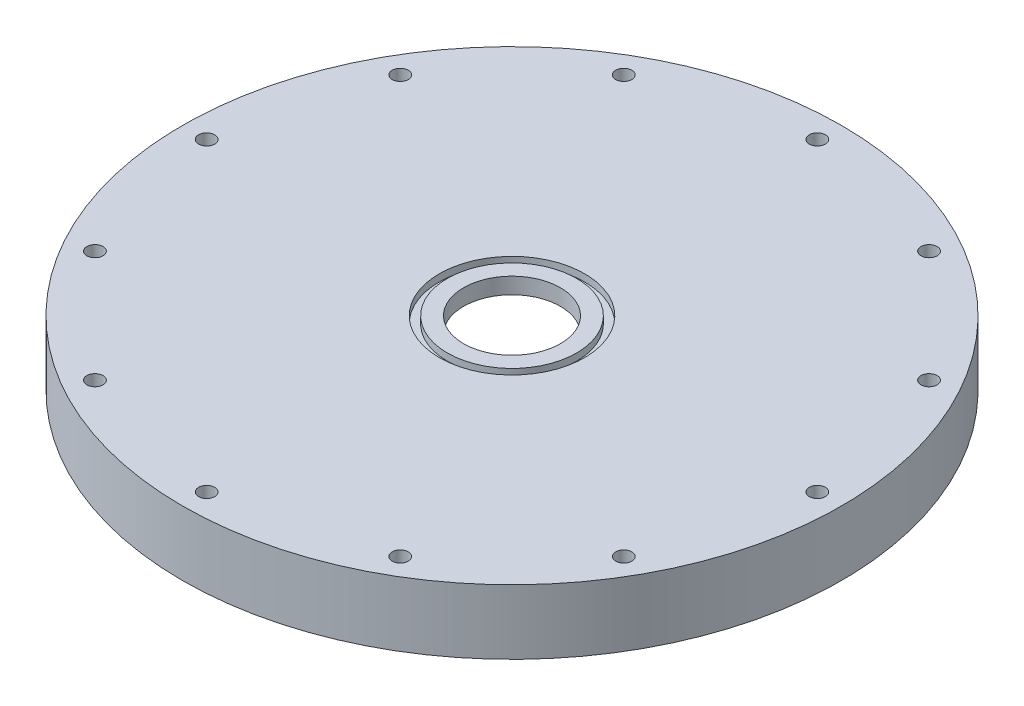
ISO-10303-21;
HEADER;
FILE_DESCRIPTION(('STEP AP214'),'2;1');
FILE_NAME('part.step','',(''),(''),'','','');
FILE_SCHEMA(('AUTOMOTIVE_DESIGN { 1 0 10303 214 1 1 1 1 }'));
ENDSEC;
DATA;
#1=APPLICATION_CONTEXT('core data for automotive mechanical design processes');
#2=APPLICATION_PROTOCOL_DEFINITION('international standard','automotive_design',2000,#1);
#3=PRODUCT_CONTEXT('',#1,'mechanical');
#4=PRODUCT('Part','Part','',(#3));
#5=PRODUCT_RELATED_PRODUCT_CATEGORY('part','',(#4));
#6=PRODUCT_DEFINITION_FORMATION('','',#4);
#7=PRODUCT_DEFINITION_CONTEXT('part definition',#1,'design');
#8=PRODUCT_DEFINITION('design','',#6,#7);
#9=PRODUCT_DEFINITION_SHAPE('','',#8);
#10=(LENGTH_UNIT() NAMED_UNIT(*) SI_UNIT(.MILLI.,.METRE.));
#11=(NAMED_UNIT(*) PLANE_ANGLE_UNIT() SI_UNIT($,.RADIAN.));
#12=(NAMED_UNIT(*) SI_UNIT($,.STERADIAN.) SOLID_ANGLE_UNIT());
#13=UNCERTAINTY_MEASURE_WITH_UNIT(LENGTH_MEASURE(1.E-05),#10,'distance_accuracy_value','');
#14=(GEOMETRIC_REPRESENTATION_CONTEXT(3) GLOBAL_UNCERTAINTY_ASSIGNED_CONTEXT((#13)) GLOBAL_UNIT_ASSIGNED_CONTEXT((#10,
#11,#12)) REPRESENTATION_CONTEXT('',''));
#15=CARTESIAN_POINT('',(0.,0.,0.));
#16=DIRECTION('',(0.,0.,1.));
#17=DIRECTION('',(1.,0.,0.));
#18=AXIS2_PLACEMENT_3D('',#15,#16,#17);
#19=CARTESIAN_POINT('',(0.,6.34999999999999,0.));
#20=DIRECTION('',(0.,-1.,0.));
#21=DIRECTION('',(0.,0.,-1.));
#22=AXIS2_PLACEMENT_3D('',#19,#20,#21);
#23=PLANE('',#22);
#24=CARTESIAN_POINT('',(0.,6.34999999999999,0.));
#25=DIRECTION('',(0.,1.,0.));
#26=DIRECTION('',(0.,0.,1.));
#27=AXIS2_PLACEMENT_3D('',#24,#25,#26);
#28=CIRCLE('',#27,19.05);
#29=CARTESIAN_POINT('',(0.,6.34999999999999,19.05));
#30=VERTEX_POINT('',#29);
#31=EDGE_CURVE('E62',#30,#30,#28,.T.);
#32=ORIENTED_EDGE('',*,*,#31,.F.);
#33=EDGE_LOOP('',(#32));
#34=FACE_BOUND('',#33,.T.);
#35=CARTESIAN_POINT('',(0.,6.34999999999999,0.));
#36=DIRECTION('',(0.,1.,0.));
#37=DIRECTION('',(0.,0.,1.));
#38=AXIS2_PLACEMENT_3D('',#35,#36,#37);
#39=CIRCLE('',#38,25.4);
#40=CARTESIAN_POINT('',(0.,6.34999999999999,25.4));
#41=VERTEX_POINT('',#40);
#42=EDGE_CURVE('E72',#41,#41,#39,.T.);
#43=ORIENTED_EDGE('',*,*,#42,.T.);
#44=EDGE_LOOP('',(#43));
#45=FACE_BOUND('',#44,.T.);
#46=ADVANCED_FACE('F36',(#34,#45),#23,.F.);
#47=CARTESIAN_POINT('',(-69.8499999999999,0.,0.));
#48=DIRECTION('',(0.,1.,0.));
#49=DIRECTION('',(0.,0.,1.));
#50=AXIS2_PLACEMENT_3D('',#47,#48,#49);
#51=PLANE('',#50);
#52=CARTESIAN_POINT('',(0.,0.,0.));
#53=DIRECTION('',(0.,1.,0.));
#54=DIRECTION('',(0.,0.,1.));
#55=AXIS2_PLACEMENT_3D('',#52,#53,#54);
#56=CIRCLE('',#55,19.05);
#57=CARTESIAN_POINT('',(0.,0.,19.05));
#58=VERTEX_POINT('',#57);
#59=EDGE_CURVE('E59',#58,#58,#56,.T.);
#60=ORIENTED_EDGE('',*,*,#59,.T.);
#61=EDGE_LOOP('',(#60));
#62=FACE_BOUND('',#61,.T.);
#63=CARTESIAN_POINT('',(0.,0.,0.));
#64=DIRECTION('',(0.,-1.,0.));
#65=DIRECTION('',(0.,0.,-1.));
#66=AXIS2_PLACEMENT_3D('',#63,#64,#65);
#67=CIRCLE('',#66,69.8499999999999);
#68=CARTESIAN_POINT('',(0.,0.,-69.8499999999999));
#69=VERTEX_POINT('',#68);
#70=EDGE_CURVE('E10',#69,#69,#67,.T.);
#71=ORIENTED_EDGE('',*,*,#70,.T.);
#72=EDGE_LOOP('',(#71));
#73=FACE_BOUND('',#72,.T.);
#74=ADVANCED_FACE('F38',(#62,#73),#51,.F.);
#75=CARTESIAN_POINT('',(0.,-16.51,0.));
#76=DIRECTION('',(0.,-1.,0.));
#77=DIRECTION('',(0.,0.,-1.));
#78=AXIS2_PLACEMENT_3D('',#75,#76,#77);
#79=TOROIDAL_SURFACE('',#78,69.85,16.51);
#80=ORIENTED_EDGE('',*,*,#70,.F.);
#81=EDGE_LOOP('',(#80));
#82=FACE_BOUND('',#81,.T.);
#83=CARTESIAN_POINT('',(0.,-16.5100000000001,0.));
#84=DIRECTION('',(0.,-1.,0.));
#85=DIRECTION('',(0.,0.,-1.));
#86=AXIS2_PLACEMENT_3D('',#83,#84,#85);
#87=CIRCLE('',#86,86.36);
#88=CARTESIAN_POINT('',(0.,-16.5100000000001,-86.36));
#89=VERTEX_POINT('',#88);
#90=EDGE_CURVE('E43',#89,#89,#87,.T.);
#91=ORIENTED_EDGE('',*,*,#90,.T.);
#92=EDGE_LOOP('',(#91));
#93=FACE_BOUND('',#92,.T.);
#94=ADVANCED_FACE('F200',(#82,#93),#79,.F.);
#95=CARTESIAN_POINT('',(0.,0.,0.));
#96=DIRECTION('',(0.,-1.,0.));
#97=DIRECTION('',(0.,0.,-1.));
#98=AXIS2_PLACEMENT_3D('',#95,#96,#97);
#99=CYLINDRICAL_SURFACE('',#98,86.36);
#100=ORIENTED_EDGE('',*,*,#90,.F.);
#101=EDGE_LOOP('',(#100));
#102=FACE_BOUND('',#101,.T.);
#103=CARTESIAN_POINT('',(0.,-19.05,0.));
#104=DIRECTION('',(0.,-1.,0.));
#105=DIRECTION('',(0.,0.,-1.));
#106=AXIS2_PLACEMENT_3D('',#103,#104,#105);
#107=CIRCLE('',#106,86.36);
#108=CARTESIAN_POINT('',(0.,-19.05,-86.36));
#109=VERTEX_POINT('',#108);
#110=EDGE_CURVE('E47',#109,#109,#107,.T.);
#111=ORIENTED_EDGE('',*,*,#110,.T.);
#112=EDGE_LOOP('',(#111));
#113=FACE_BOUND('',#112,.T.);
#114=ADVANCED_FACE('F191',(#102,#113),#99,.F.);
#115=CARTESIAN_POINT('',(-129.54,-19.05,0.));
#116=DIRECTION('',(0.,1.,0.));
#117=DIRECTION('',(0.,0.,1.));
#118=AXIS2_PLACEMENT_3D('',#115,#116,#117);
#119=PLANE('',#118);
#120=CARTESIAN_POINT('',(0.,-19.05,-120.015));
#121=DIRECTION('',(0.,1.,0.));
#122=DIRECTION('',(0.,0.,1.));
#123=AXIS2_PLACEMENT_3D('',#120,#121,#122);
#124=CIRCLE('',#123,3.175);
#125=CARTESIAN_POINT('',(0.,-19.05,-116.84));
#126=VERTEX_POINT('',#125);
#127=EDGE_CURVE('E143',#126,#126,#124,.T.);
#128=ORIENTED_EDGE('',*,*,#127,.T.);
#129=EDGE_LOOP('',(#128));
#130=FACE_BOUND('',#129,.T.);
#131=CARTESIAN_POINT('',(-60.0074999999977,-19.05,-103.936038835181));
#132=DIRECTION('',(0.,1.,0.));
#133=DIRECTION('',(0.,0.,1.));
#134=AXIS2_PLACEMENT_3D('',#131,#132,#133);
#135=CIRCLE('',#134,3.175);
#136=CARTESIAN_POINT('',(-60.0074999999977,-19.05,-100.761038835181));
#137=VERTEX_POINT('',#136);
#138=EDGE_CURVE('E137',#137,#137,#135,.T.);
#139=ORIENTED_EDGE('',*,*,#138,.T.);
#140=EDGE_LOOP('',(#139));
#141=FACE_BOUND('',#140,.T.);
#142=CARTESIAN_POINT('',(-103.936038835181,-19.05,-60.0074999999852));
#143=DIRECTION('',(0.,1.,0.));
#144=DIRECTION('',(0.,0.,1.));
#145=AXIS2_PLACEMENT_3D('',#142,#143,#144);
#146=CIRCLE('',#145,3.175);
#147=CARTESIAN_POINT('',(-103.936038835181,-19.05,-56.8324999999852));
#148=VERTEX_POINT('',#147);
#149=EDGE_CURVE('E131',#148,#148,#146,.T.);
#150=ORIENTED_EDGE('',*,*,#149,.T.);
#151=EDGE_LOOP('',(#150));
#152=FACE_BOUND('',#151,.T.);
#153=CARTESIAN_POINT('',(-120.014999999983,-19.05,1.70478084871697E-11));
#154=DIRECTION('',(0.,1.,0.));
#155=DIRECTION('',(0.,0.,1.));
#156=AXIS2_PLACEMENT_3D('',#153,#154,#155);
#157=CIRCLE('',#156,3.175);
#158=CARTESIAN_POINT('',(-120.014999999983,-19.05,3.17500000001705));
#159=VERTEX_POINT('',#158);
#160=EDGE_CURVE('E125',#159,#159,#157,.T.);
#161=ORIENTED_EDGE('',*,*,#160,.T.);
#162=EDGE_LOOP('',(#161));
#163=FACE_BOUND('',#162,.T.);
#164=CARTESIAN_POINT('',(-103.936038835164,-19.05,60.0075000000148));
#165=DIRECTION('',(0.,1.,0.));
#166=DIRECTION('',(0.,0.,1.));
#167=AXIS2_PLACEMENT_3D('',#164,#165,#166);
#168=CIRCLE('',#167,3.175);
#169=CARTESIAN_POINT('',(-103.936038835164,-19.05,63.1825000000148));
#170=VERTEX_POINT('',#169);
#171=EDGE_CURVE('E119',#170,#170,#168,.T.);
#172=ORIENTED_EDGE('',*,*,#171,.T.);
#173=EDGE_LOOP('',(#172));
#174=FACE_BOUND('',#173,.T.);
#175=CARTESIAN_POINT('',(-60.0074999999682,-19.05,103.936038835198));
#176=DIRECTION('',(0.,1.,0.));
#177=DIRECTION('',(0.,0.,1.));
#178=AXIS2_PLACEMENT_3D('',#175,#176,#177);
#179=CIRCLE('',#178,3.175);
#180=CARTESIAN_POINT('',(-60.0074999999682,-19.05,107.111038835198));
#181=VERTEX_POINT('',#180);
#182=EDGE_CURVE('E113',#181,#181,#179,.T.);
#183=ORIENTED_EDGE('',*,*,#182,.T.);
#184=EDGE_LOOP('',(#183));
#185=FACE_BOUND('',#184,.T.);
#186=CARTESIAN_POINT('',(3.40662217772195E-11,-19.05,120.015));
#187=DIRECTION('',(0.,1.,0.));
#188=DIRECTION('',(0.,0.,1.));
#189=AXIS2_PLACEMENT_3D('',#186,#187,#188);
#190=CIRCLE('',#189,3.175);
#191=CARTESIAN_POINT('',(3.40662217772195E-11,-19.05,123.19));
#192=VERTEX_POINT('',#191);
#193=EDGE_CURVE('E107',#192,#192,#190,.T.);
#194=ORIENTED_EDGE('',*,*,#193,.T.);
#195=EDGE_LOOP('',(#194));
#196=FACE_BOUND('',#195,.T.);
#197=CARTESIAN_POINT('',(60.0075000000318,-19.05,103.936038835181));
#198=DIRECTION('',(0.,1.,0.));
#199=DIRECTION('',(0.,0.,1.));
#200=AXIS2_PLACEMENT_3D('',#197,#198,#199);
#201=CIRCLE('',#200,3.17499999999999);
#202=CARTESIAN_POINT('',(60.0075000000318,-19.05,107.111038835181));
#203=VERTEX_POINT('',#202);
#204=EDGE_CURVE('E101',#203,#203,#201,.T.);
#205=ORIENTED_EDGE('',*,*,#204,.T.);
#206=EDGE_LOOP('',(#205));
#207=FACE_BOUND('',#206,.T.);
#208=CARTESIAN_POINT('',(103.936038835215,-19.05,60.0074999999852));
#209=DIRECTION('',(0.,1.,0.));
#210=DIRECTION('',(0.,0.,1.));
#211=AXIS2_PLACEMENT_3D('',#208,#209,#210);
#212=CIRCLE('',#211,3.175);
#213=CARTESIAN_POINT('',(103.936038835215,-19.05,63.1824999999852));
#214=VERTEX_POINT('',#213);
#215=EDGE_CURVE('E95',#214,#214,#212,.T.);
#216=ORIENTED_EDGE('',*,*,#215,.T.);
#217=EDGE_LOOP('',(#216));
#218=FACE_BOUND('',#217,.T.);
#219=CARTESIAN_POINT('',(120.015000000017,-19.05,-1.70331108886097E-11));
#220=DIRECTION('',(0.,1.,0.));
#221=DIRECTION('',(0.,0.,1.));
#222=AXIS2_PLACEMENT_3D('',#219,#220,#221);
#223=CIRCLE('',#222,3.175);
#224=CARTESIAN_POINT('',(120.015000000017,-19.05,3.17499999998296));
#225=VERTEX_POINT('',#224);
#226=EDGE_CURVE('E89',#225,#225,#223,.T.);
#227=ORIENTED_EDGE('',*,*,#226,.T.);
#228=EDGE_LOOP('',(#227));
#229=FACE_BOUND('',#228,.T.);
#230=CARTESIAN_POINT('',(103.936038835198,-19.05,-60.0075000000148));
#231=DIRECTION('',(0.,1.,0.));
#232=DIRECTION('',(0.,0.,1.));
#233=AXIS2_PLACEMENT_3D('',#230,#231,#232);
#234=CIRCLE('',#233,3.175);
#235=CARTESIAN_POINT('',(103.936038835198,-19.05,-56.8325000000148));
#236=VERTEX_POINT('',#235);
#237=EDGE_CURVE('E83',#236,#236,#234,.T.);
#238=ORIENTED_EDGE('',*,*,#237,.T.);
#239=EDGE_LOOP('',(#238));
#240=FACE_BOUND('',#239,.T.);
#241=CARTESIAN_POINT('',(60.0075000000023,-19.05,-103.936038835198));
#242=DIRECTION('',(0.,1.,0.));
#243=DIRECTION('',(0.,0.,1.));
#244=AXIS2_PLACEMENT_3D('',#241,#242,#243);
#245=CIRCLE('',#244,3.175);
#246=CARTESIAN_POINT('',(60.0075000000023,-19.05,-100.761038835198));
#247=VERTEX_POINT('',#246);
#248=EDGE_CURVE('E75',#247,#247,#245,.T.);
#249=ORIENTED_EDGE('',*,*,#248,.T.);
#250=EDGE_LOOP('',(#249));
#251=FACE_BOUND('',#250,.T.);
#252=ORIENTED_EDGE('',*,*,#110,.F.);
#253=EDGE_LOOP('',(#252));
#254=FACE_BOUND('',#253,.T.);
#255=CARTESIAN_POINT('',(0.,-19.05,0.));
#256=DIRECTION('',(0.,-1.,0.));
#257=DIRECTION('',(0.,0.,-1.));
#258=AXIS2_PLACEMENT_3D('',#255,#256,#257);
#259=CIRCLE('',#258,129.54);
#260=CARTESIAN_POINT('',(0.,-19.05,-129.54));
#261=VERTEX_POINT('',#260);
#262=EDGE_CURVE('E51',#261,#261,#259,.T.);
#263=ORIENTED_EDGE('',*,*,#262,.T.);
#264=EDGE_LOOP('',(#263));
#265=FACE_BOUND('',#264,.T.);
#266=ADVANCED_FACE('F185',(#130,#141,#152,#163,#174,#185,#196,#207,#218,#229,#240,#251,#254,
#265),#119,.F.);
#267=CARTESIAN_POINT('',(0.,0.,0.));
#268=DIRECTION('',(0.,-1.,0.));
#269=DIRECTION('',(0.,0.,-1.));
#270=AXIS2_PLACEMENT_3D('',#267,#268,#269);
#271=CYLINDRICAL_SURFACE('',#270,129.54);
#272=ORIENTED_EDGE('',*,*,#262,.F.);
#273=EDGE_LOOP('',(#272));
#274=FACE_BOUND('',#273,.T.);
#275=CARTESIAN_POINT('',(0.,6.34999999999998,0.));
#276=DIRECTION('',(0.,-1.,0.));
#277=DIRECTION('',(0.,0.,-1.));
#278=AXIS2_PLACEMENT_3D('',#275,#276,#277);
#279=CIRCLE('',#278,129.54);
#280=CARTESIAN_POINT('',(0.,6.34999999999998,-129.54));
#281=VERTEX_POINT('',#280);
#282=EDGE_CURVE('E56',#281,#281,#279,.T.);
#283=ORIENTED_EDGE('',*,*,#282,.T.);
#284=EDGE_LOOP('',(#283));
#285=FACE_BOUND('',#284,.T.);
#286=ADVANCED_FACE('F156',(#274,#285),#271,.T.);
#287=CARTESIAN_POINT('',(0.,6.34999999999999,-120.015));
#288=DIRECTION('',(0.,1.,0.));
#289=DIRECTION('',(0.,0.,1.));
#290=AXIS2_PLACEMENT_3D('',#287,#288,#289);
#291=CIRCLE('',#290,3.17499999999999);
#292=CARTESIAN_POINT('',(0.,6.34999999999999,-116.84));
#293=VERTEX_POINT('',#292);
#294=EDGE_CURVE('E146',#293,#293,#291,.T.);
#295=ORIENTED_EDGE('',*,*,#294,.F.);
#296=EDGE_LOOP('',(#295));
#297=FACE_BOUND('',#296,.T.);
#298=CARTESIAN_POINT('',(-60.0074999999977,6.34999999999999,-103.936038835181));
#299=DIRECTION('',(0.,1.,0.));
#300=DIRECTION('',(0.,0.,1.));
#301=AXIS2_PLACEMENT_3D('',#298,#299,#300);
#302=CIRCLE('',#301,3.17499999999998);
#303=CARTESIAN_POINT('',(-60.0074999999977,6.34999999999999,-100.761038835181));
#304=VERTEX_POINT('',#303);
#305=EDGE_CURVE('E140',#304,#304,#302,.T.);
#306=ORIENTED_EDGE('',*,*,#305,.F.);
#307=EDGE_LOOP('',(#306));
#308=FACE_BOUND('',#307,.T.);
#309=CARTESIAN_POINT('',(-103.936038835181,6.34999999999999,-60.0074999999852));
#310=DIRECTION('',(0.,1.,0.));
#311=DIRECTION('',(0.,0.,1.));
#312=AXIS2_PLACEMENT_3D('',#309,#310,#311);
#313=CIRCLE('',#312,3.17499999999998);
#314=CARTESIAN_POINT('',(-103.936038835181,6.34999999999999,-56.8324999999852));
#315=VERTEX_POINT('',#314);
#316=EDGE_CURVE('E134',#315,#315,#313,.T.);
#317=ORIENTED_EDGE('',*,*,#316,.F.);
#318=EDGE_LOOP('',(#317));
#319=FACE_BOUND('',#318,.T.);
#320=CARTESIAN_POINT('',(-120.014999999983,6.34999999999999,1.70478084871697E-11));
#321=DIRECTION('',(0.,1.,0.));
#322=DIRECTION('',(0.,0.,1.));
#323=AXIS2_PLACEMENT_3D('',#320,#321,#322);
#324=CIRCLE('',#323,3.17499999999998);
#325=CARTESIAN_POINT('',(-120.014999999983,6.34999999999999,3.17500000001703));
#326=VERTEX_POINT('',#325);
#327=EDGE_CURVE('E128',#326,#326,#324,.T.);
#328=ORIENTED_EDGE('',*,*,#327,.F.);
#329=EDGE_LOOP('',(#328));
#330=FACE_BOUND('',#329,.T.);
#331=CARTESIAN_POINT('',(-103.936038835164,6.34999999999999,60.0075000000148));
#332=DIRECTION('',(0.,1.,0.));
#333=DIRECTION('',(0.,0.,1.));
#334=AXIS2_PLACEMENT_3D('',#331,#332,#333);
#335=CIRCLE('',#334,3.17499999999998);
#336=CARTESIAN_POINT('',(-103.936038835164,6.34999999999999,63.1825000000148));
#337=VERTEX_POINT('',#336);
#338=EDGE_CURVE('E122',#337,#337,#335,.T.);
#339=ORIENTED_EDGE('',*,*,#338,.F.);
#340=EDGE_LOOP('',(#339));
#341=FACE_BOUND('',#340,.T.);
#342=CARTESIAN_POINT('',(-60.0074999999682,6.34999999999999,103.936038835198));
#343=DIRECTION('',(0.,1.,0.));
#344=DIRECTION('',(0.,0.,1.));
#345=AXIS2_PLACEMENT_3D('',#342,#343,#344);
#346=CIRCLE('',#345,3.17499999999998);
#347=CARTESIAN_POINT('',(-60.0074999999682,6.34999999999999,107.111038835198));
#348=VERTEX_POINT('',#347);
#349=EDGE_CURVE('E116',#348,#348,#346,.T.);
#350=ORIENTED_EDGE('',*,*,#349,.F.);
#351=EDGE_LOOP('',(#350));
#352=FACE_BOUND('',#351,.T.);
#353=CARTESIAN_POINT('',(3.40662217772195E-11,6.34999999999999,120.015));
#354=DIRECTION('',(0.,1.,0.));
#355=DIRECTION('',(0.,0.,1.));
#356=AXIS2_PLACEMENT_3D('',#353,#354,#355);
#357=CIRCLE('',#356,3.17499999999999);
#358=CARTESIAN_POINT('',(3.40662217772195E-11,6.34999999999999,123.19));
#359=VERTEX_POINT('',#358);
#360=EDGE_CURVE('E110',#359,#359,#357,.T.);
#361=ORIENTED_EDGE('',*,*,#360,.F.);
#362=EDGE_LOOP('',(#361));
#363=FACE_BOUND('',#362,.T.);
#364=CARTESIAN_POINT('',(60.0075000000318,6.34999999999999,103.936038835181));
#365=DIRECTION('',(0.,1.,0.));
#366=DIRECTION('',(0.,0.,1.));
#367=AXIS2_PLACEMENT_3D('',#364,#365,#366);
#368=CIRCLE('',#367,3.17499999999999);
#369=CARTESIAN_POINT('',(60.0075000000318,6.34999999999999,107.111038835181));
#370=VERTEX_POINT('',#369);
#371=EDGE_CURVE('E104',#370,#370,#368,.T.);
#372=ORIENTED_EDGE('',*,*,#371,.F.);
#373=EDGE_LOOP('',(#372));
#374=FACE_BOUND('',#373,.T.);
#375=CARTESIAN_POINT('',(103.936038835215,6.34999999999999,60.0074999999852));
#376=DIRECTION('',(0.,1.,0.));
#377=DIRECTION('',(0.,0.,1.));
#378=AXIS2_PLACEMENT_3D('',#375,#376,#377);
#379=CIRCLE('',#378,3.17499999999998);
#380=CARTESIAN_POINT('',(103.936038835215,6.34999999999999,63.1824999999852));
#381=VERTEX_POINT('',#380);
#382=EDGE_CURVE('E98',#381,#381,#379,.T.);
#383=ORIENTED_EDGE('',*,*,#382,.F.);
#384=EDGE_LOOP('',(#383));
#385=FACE_BOUND('',#384,.T.);
#386=CARTESIAN_POINT('',(120.015000000017,6.34999999999999,-1.70331108886097E-11));
#387=DIRECTION('',(0.,1.,0.));
#388=DIRECTION('',(0.,0.,1.));
#389=AXIS2_PLACEMENT_3D('',#386,#387,#388);
#390=CIRCLE('',#389,3.17499999999998);
#391=CARTESIAN_POINT('',(120.015000000017,6.34999999999999,3.17499999998295));
#392=VERTEX_POINT('',#391);
#393=EDGE_CURVE('E92',#392,#392,#390,.T.);
#394=ORIENTED_EDGE('',*,*,#393,.F.);
#395=EDGE_LOOP('',(#394));
#396=FACE_BOUND('',#395,.T.);
#397=CARTESIAN_POINT('',(103.936038835198,6.34999999999999,-60.0075000000148));
#398=DIRECTION('',(0.,1.,0.));
#399=DIRECTION('',(0.,0.,1.));
#400=AXIS2_PLACEMENT_3D('',#397,#398,#399);
#401=CIRCLE('',#400,3.17499999999998);
#402=CARTESIAN_POINT('',(103.936038835198,6.34999999999999,-56.8325000000148));
#403=VERTEX_POINT('',#402);
#404=EDGE_CURVE('E86',#403,#403,#401,.T.);
#405=ORIENTED_EDGE('',*,*,#404,.F.);
#406=EDGE_LOOP('',(#405));
#407=FACE_BOUND('',#406,.T.);
#408=CARTESIAN_POINT('',(60.0075000000023,6.34999999999999,-103.936038835198));
#409=DIRECTION('',(0.,1.,0.));
#410=DIRECTION('',(0.,0.,1.));
#411=AXIS2_PLACEMENT_3D('',#408,#409,#410);
#412=CIRCLE('',#411,3.17499999999998);
#413=CARTESIAN_POINT('',(60.0075000000023,6.34999999999999,-100.761038835198));
#414=VERTEX_POINT('',#413);
#415=EDGE_CURVE('E80',#414,#414,#412,.T.);
#416=ORIENTED_EDGE('',*,*,#415,.F.);
#417=EDGE_LOOP('',(#416));
#418=FACE_BOUND('',#417,.T.);
#419=CARTESIAN_POINT('',(0.,6.34999999999999,0.));
#420=DIRECTION('',(0.,1.,0.));
#421=DIRECTION('',(0.,0.,1.));
#422=AXIS2_PLACEMENT_3D('',#419,#420,#421);
#423=CIRCLE('',#422,28.575);
#424=CARTESIAN_POINT('',(0.,6.34999999999999,28.575));
#425=VERTEX_POINT('',#424);
#426=EDGE_CURVE('E66',#425,#425,#423,.T.);
#427=ORIENTED_EDGE('',*,*,#426,.F.);
#428=EDGE_LOOP('',(#427));
#429=FACE_BOUND('',#428,.T.);
#430=ORIENTED_EDGE('',*,*,#282,.F.);
#431=EDGE_LOOP('',(#430));
#432=FACE_BOUND('',#431,.T.);
#433=ADVANCED_FACE('F152',(#297,#308,#319,#330,#341,#352,#363,#374,#385,#396,#407,#418,#429,
#432),#23,.F.);
#434=CARTESIAN_POINT('',(0.,-19.05,0.));
#435=DIRECTION('',(0.,1.,0.));
#436=DIRECTION('',(0.,0.,1.));
#437=AXIS2_PLACEMENT_3D('',#434,#435,#436);
#438=CYLINDRICAL_SURFACE('',#437,19.05);
#439=ORIENTED_EDGE('',*,*,#31,.T.);
#440=EDGE_LOOP('',(#439));
#441=FACE_BOUND('',#440,.T.);
#442=ORIENTED_EDGE('',*,*,#59,.F.);
#443=EDGE_LOOP('',(#442));
#444=FACE_BOUND('',#443,.T.);
#445=ADVANCED_FACE('F155',(#441,#444),#438,.F.);
#446=CARTESIAN_POINT('',(0.,3.55599999999999,0.));
#447=DIRECTION('',(0.,1.,0.));
#448=DIRECTION('',(0.,0.,1.));
#449=AXIS2_PLACEMENT_3D('',#446,#447,#448);
#450=CYLINDRICAL_SURFACE('',#449,28.575);
#451=CARTESIAN_POINT('',(0.,3.55599999999999,0.));
#452=DIRECTION('',(0.,1.,0.));
#453=DIRECTION('',(0.,0.,1.));
#454=AXIS2_PLACEMENT_3D('',#451,#452,#453);
#455=CIRCLE('',#454,28.575);
#456=CARTESIAN_POINT('',(0.,3.55599999999999,28.575));
#457=VERTEX_POINT('',#456);
#458=EDGE_CURVE('E65',#457,#457,#455,.T.);
#459=ORIENTED_EDGE('',*,*,#458,.F.);
#460=EDGE_LOOP('',(#459));
#461=FACE_BOUND('',#460,.T.);
#462=ORIENTED_EDGE('',*,*,#426,.T.);
#463=EDGE_LOOP('',(#462));
#464=FACE_BOUND('',#463,.T.);
#465=ADVANCED_FACE('F207',(#461,#464),#450,.F.);
#466=CARTESIAN_POINT('',(0.,3.55599999999999,0.));
#467=DIRECTION('',(0.,1.,0.));
#468=DIRECTION('',(0.,0.,1.));
#469=AXIS2_PLACEMENT_3D('',#466,#467,#468);
#470=PLANE('',#469);
#471=CARTESIAN_POINT('',(0.,3.55599999999999,0.));
#472=DIRECTION('',(0.,1.,0.));
#473=DIRECTION('',(0.,0.,1.));
#474=AXIS2_PLACEMENT_3D('',#471,#472,#473);
#475=CIRCLE('',#474,25.4);
#476=CARTESIAN_POINT('',(0.,3.55599999999999,25.4));
#477=VERTEX_POINT('',#476);
#478=EDGE_CURVE('E69',#477,#477,#475,.T.);
#479=ORIENTED_EDGE('',*,*,#478,.F.);
#480=EDGE_LOOP('',(#479));
#481=FACE_BOUND('',#480,.T.);
#482=ORIENTED_EDGE('',*,*,#458,.T.);
#483=EDGE_LOOP('',(#482));
#484=FACE_BOUND('',#483,.T.);
#485=ADVANCED_FACE('F211',(#481,#484),#470,.T.);
#486=CARTESIAN_POINT('',(0.,3.55599999999999,0.));
#487=DIRECTION('',(0.,1.,0.));
#488=DIRECTION('',(0.,0.,1.));
#489=AXIS2_PLACEMENT_3D('',#486,#487,#488);
#490=CYLINDRICAL_SURFACE('',#489,25.4);
#491=ORIENTED_EDGE('',*,*,#478,.T.);
#492=EDGE_LOOP('',(#491));
#493=FACE_BOUND('',#492,.T.);
#494=ORIENTED_EDGE('',*,*,#42,.F.);
#495=EDGE_LOOP('',(#494));
#496=FACE_BOUND('',#495,.T.);
#497=ADVANCED_FACE('F215',(#493,#496),#490,.T.);
#498=CARTESIAN_POINT('',(60.0075000000023,6.34999999999999,-103.936038835198));
#499=DIRECTION('',(0.,1.,0.));
#500=DIRECTION('',(0.,0.,1.));
#501=AXIS2_PLACEMENT_3D('',#498,#499,#500);
#502=CYLINDRICAL_SURFACE('',#501,3.17499999999999);
#503=ORIENTED_EDGE('',*,*,#248,.F.);
#504=EDGE_LOOP('',(#503));
#505=FACE_BOUND('',#504,.T.);
#506=ORIENTED_EDGE('',*,*,#415,.T.);
#507=EDGE_LOOP('',(#506));
#508=FACE_BOUND('',#507,.T.);
#509=ADVANCED_FACE('F219',(#505,#508),#502,.F.);
#510=CARTESIAN_POINT('',(103.936038835198,6.34999999999999,-60.0075000000148));
#511=DIRECTION('',(0.,1.,0.));
#512=DIRECTION('',(0.,0.,1.));
#513=AXIS2_PLACEMENT_3D('',#510,#511,#512);
#514=CYLINDRICAL_SURFACE('',#513,3.17499999999999);
#515=ORIENTED_EDGE('',*,*,#237,.F.);
#516=EDGE_LOOP('',(#515));
#517=FACE_BOUND('',#516,.T.);
#518=ORIENTED_EDGE('',*,*,#404,.T.);
#519=EDGE_LOOP('',(#518));
#520=FACE_BOUND('',#519,.T.);
#521=ADVANCED_FACE('F223',(#517,#520),#514,.F.);
#522=CARTESIAN_POINT('',(120.015000000017,6.34999999999999,-1.70331108886097E-11));
#523=DIRECTION('',(0.,1.,0.));
#524=DIRECTION('',(0.,0.,1.));
#525=AXIS2_PLACEMENT_3D('',#522,#523,#524);
#526=CYLINDRICAL_SURFACE('',#525,3.17499999999999);
#527=ORIENTED_EDGE('',*,*,#226,.F.);
#528=EDGE_LOOP('',(#527));
#529=FACE_BOUND('',#528,.T.);
#530=ORIENTED_EDGE('',*,*,#393,.T.);
#531=EDGE_LOOP('',(#530));
#532=FACE_BOUND('',#531,.T.);
#533=ADVANCED_FACE('F227',(#529,#532),#526,.F.);
#534=CARTESIAN_POINT('',(103.936038835215,6.34999999999999,60.0074999999852));
#535=DIRECTION('',(0.,1.,0.));
#536=DIRECTION('',(0.,0.,1.));
#537=AXIS2_PLACEMENT_3D('',#534,#535,#536);
#538=CYLINDRICAL_SURFACE('',#537,3.17499999999999);
#539=ORIENTED_EDGE('',*,*,#215,.F.);
#540=EDGE_LOOP('',(#539));
#541=FACE_BOUND('',#540,.T.);
#542=ORIENTED_EDGE('',*,*,#382,.T.);
#543=EDGE_LOOP('',(#542));
#544=FACE_BOUND('',#543,.T.);
#545=ADVANCED_FACE('F231',(#541,#544),#538,.F.);
#546=CARTESIAN_POINT('',(60.0075000000318,6.34999999999999,103.936038835181));
#547=DIRECTION('',(0.,1.,0.));
#548=DIRECTION('',(0.,0.,1.));
#549=AXIS2_PLACEMENT_3D('',#546,#547,#548);
#550=CYLINDRICAL_SURFACE('',#549,3.17499999999999);
#551=ORIENTED_EDGE('',*,*,#204,.F.);
#552=EDGE_LOOP('',(#551));
#553=FACE_BOUND('',#552,.T.);
#554=ORIENTED_EDGE('',*,*,#371,.T.);
#555=EDGE_LOOP('',(#554));
#556=FACE_BOUND('',#555,.T.);
#557=ADVANCED_FACE('F235',(#553,#556),#550,.F.);
#558=CARTESIAN_POINT('',(3.40662217772195E-11,6.34999999999999,120.015));
#559=DIRECTION('',(0.,1.,0.));
#560=DIRECTION('',(0.,0.,1.));
#561=AXIS2_PLACEMENT_3D('',#558,#559,#560);
#562=CYLINDRICAL_SURFACE('',#561,3.17499999999999);
#563=ORIENTED_EDGE('',*,*,#193,.F.);
#564=EDGE_LOOP('',(#563));
#565=FACE_BOUND('',#564,.T.);
#566=ORIENTED_EDGE('',*,*,#360,.T.);
#567=EDGE_LOOP('',(#566));
#568=FACE_BOUND('',#567,.T.);
#569=ADVANCED_FACE('F239',(#565,#568),#562,.F.);
#570=CARTESIAN_POINT('',(-60.0074999999682,6.34999999999999,103.936038835198));
#571=DIRECTION('',(0.,1.,0.));
#572=DIRECTION('',(0.,0.,1.));
#573=AXIS2_PLACEMENT_3D('',#570,#571,#572);
#574=CYLINDRICAL_SURFACE('',#573,3.17499999999999);
#575=ORIENTED_EDGE('',*,*,#182,.F.);
#576=EDGE_LOOP('',(#575));
#577=FACE_BOUND('',#576,.T.);
#578=ORIENTED_EDGE('',*,*,#349,.T.);
#579=EDGE_LOOP('',(#578));
#580=FACE_BOUND('',#579,.T.);
#581=ADVANCED_FACE('F243',(#577,#580),#574,.F.);
#582=CARTESIAN_POINT('',(-103.936038835164,6.34999999999999,60.0075000000148));
#583=DIRECTION('',(0.,1.,0.));
#584=DIRECTION('',(0.,0.,1.));
#585=AXIS2_PLACEMENT_3D('',#582,#583,#584);
#586=CYLINDRICAL_SURFACE('',#585,3.17499999999999);
#587=ORIENTED_EDGE('',*,*,#171,.F.);
#588=EDGE_LOOP('',(#587));
#589=FACE_BOUND('',#588,.T.);
#590=ORIENTED_EDGE('',*,*,#338,.T.);
#591=EDGE_LOOP('',(#590));
#592=FACE_BOUND('',#591,.T.);
#593=ADVANCED_FACE('F247',(#589,#592),#586,.F.);
#594=CARTESIAN_POINT('',(-120.014999999983,6.34999999999999,1.70478084871697E-11));
#595=DIRECTION('',(0.,1.,0.));
#596=DIRECTION('',(0.,0.,1.));
#597=AXIS2_PLACEMENT_3D('',#594,#595,#596);
#598=CYLINDRICAL_SURFACE('',#597,3.17499999999999);
#599=ORIENTED_EDGE('',*,*,#160,.F.);
#600=EDGE_LOOP('',(#599));
#601=FACE_BOUND('',#600,.T.);
#602=ORIENTED_EDGE('',*,*,#327,.T.);
#603=EDGE_LOOP('',(#602));
#604=FACE_BOUND('',#603,.T.);
#605=ADVANCED_FACE('F251',(#601,#604),#598,.F.);
#606=CARTESIAN_POINT('',(-103.936038835181,6.34999999999999,-60.0074999999852));
#607=DIRECTION('',(0.,1.,0.));
#608=DIRECTION('',(0.,0.,1.));
#609=AXIS2_PLACEMENT_3D('',#606,#607,#608);
#610=CYLINDRICAL_SURFACE('',#609,3.17499999999999);
#611=ORIENTED_EDGE('',*,*,#149,.F.);
#612=EDGE_LOOP('',(#611));
#613=FACE_BOUND('',#612,.T.);
#614=ORIENTED_EDGE('',*,*,#316,.T.);
#615=EDGE_LOOP('',(#614));
#616=FACE_BOUND('',#615,.T.);
#617=ADVANCED_FACE('F255',(#613,#616),#610,.F.);
#618=CARTESIAN_POINT('',(-60.0074999999977,6.34999999999999,-103.936038835181));
#619=DIRECTION('',(0.,1.,0.));
#620=DIRECTION('',(0.,0.,1.));
#621=AXIS2_PLACEMENT_3D('',#618,#619,#620);
#622=CYLINDRICAL_SURFACE('',#621,3.17499999999999);
#623=ORIENTED_EDGE('',*,*,#138,.F.);
#624=EDGE_LOOP('',(#623));
#625=FACE_BOUND('',#624,.T.);
#626=ORIENTED_EDGE('',*,*,#305,.T.);
#627=EDGE_LOOP('',(#626));
#628=FACE_BOUND('',#627,.T.);
#629=ADVANCED_FACE('F259',(#625,#628),#622,.F.);
#630=CARTESIAN_POINT('',(0.,6.34999999999999,-120.015));
#631=DIRECTION('',(0.,1.,0.));
#632=DIRECTION('',(0.,0.,1.));
#633=AXIS2_PLACEMENT_3D('',#630,#631,#632);
#634=CYLINDRICAL_SURFACE('',#633,3.17499999999999);
#635=ORIENTED_EDGE('',*,*,#127,.F.);
#636=EDGE_LOOP('',(#635));
#637=FACE_BOUND('',#636,.T.);
#638=ORIENTED_EDGE('',*,*,#294,.T.);
#639=EDGE_LOOP('',(#638));
#640=FACE_BOUND('',#639,.T.);
#641=ADVANCED_FACE('F150',(#637,#640),#634,.F.);
#642=CLOSED_SHELL('',(#46,#74,#94,#114,#266,#286,#433,#445,#465,#485,#497,#509,#521,#533,#545,
#557,#569,#581,#593,#605,#617,#629,#641));
#643=MANIFOLD_SOLID_BREP('B2',#642);
#644=ADVANCED_BREP_SHAPE_REPRESENTATION('',(#18,#643),#14);
#645=SHAPE_DEFINITION_REPRESENTATION(#9,#644);
ENDSEC;
END-ISO-10303-21;
